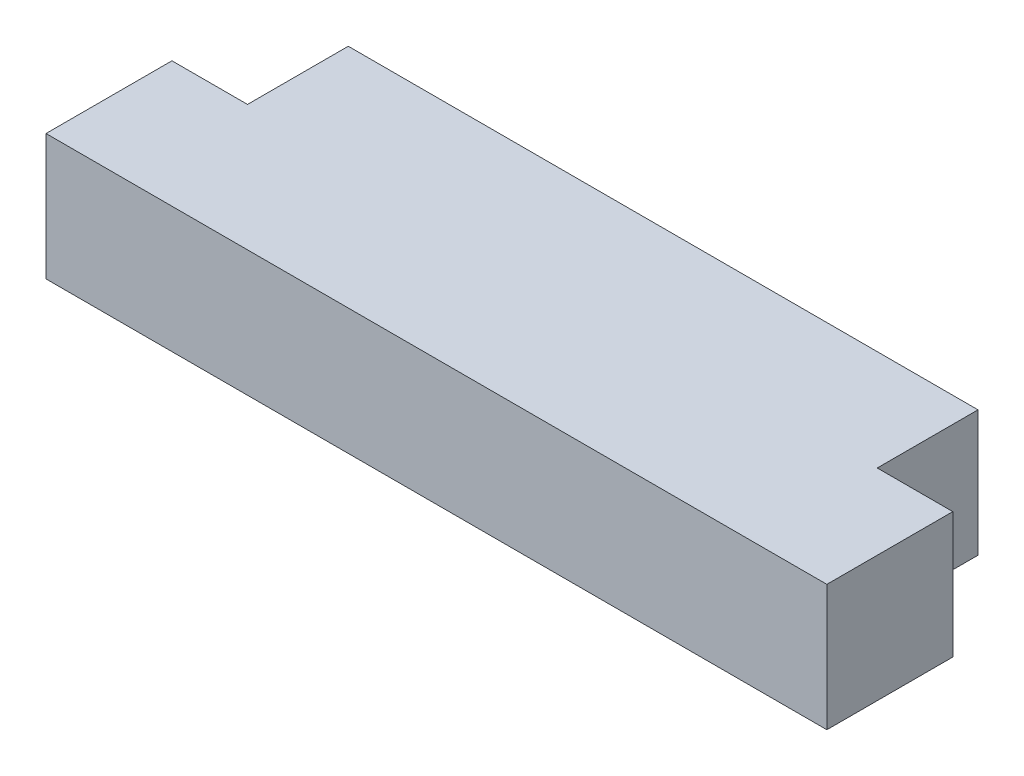
ISO-10303-21;
HEADER;
FILE_DESCRIPTION(('STEP AP214'),'2;1');
FILE_NAME('part.step','',(''),(''),'','','');
FILE_SCHEMA(('AUTOMOTIVE_DESIGN { 1 0 10303 214 1 1 1 1 }'));
ENDSEC;
DATA;
#1=APPLICATION_CONTEXT('core data for automotive mechanical design processes');
#2=APPLICATION_PROTOCOL_DEFINITION('international standard','automotive_design',2000,#1);
#3=PRODUCT_CONTEXT('',#1,'mechanical');
#4=PRODUCT('Part','Part','',(#3));
#5=PRODUCT_RELATED_PRODUCT_CATEGORY('part','',(#4));
#6=PRODUCT_DEFINITION_FORMATION('','',#4);
#7=PRODUCT_DEFINITION_CONTEXT('part definition',#1,'design');
#8=PRODUCT_DEFINITION('design','',#6,#7);
#9=PRODUCT_DEFINITION_SHAPE('','',#8);
#10=(LENGTH_UNIT() NAMED_UNIT(*) SI_UNIT(.MILLI.,.METRE.));
#11=(NAMED_UNIT(*) PLANE_ANGLE_UNIT() SI_UNIT($,.RADIAN.));
#12=(NAMED_UNIT(*) SI_UNIT($,.STERADIAN.) SOLID_ANGLE_UNIT());
#13=UNCERTAINTY_MEASURE_WITH_UNIT(LENGTH_MEASURE(1.E-05),#10,'distance_accuracy_value','');
#14=(GEOMETRIC_REPRESENTATION_CONTEXT(3) GLOBAL_UNCERTAINTY_ASSIGNED_CONTEXT((#13)) GLOBAL_UNIT_ASSIGNED_CONTEXT((#10,
#11,#12)) REPRESENTATION_CONTEXT('',''));
#15=CARTESIAN_POINT('',(0.,0.,0.));
#16=DIRECTION('',(0.,0.,1.));
#17=DIRECTION('',(1.,0.,0.));
#18=AXIS2_PLACEMENT_3D('',#15,#16,#17);
#19=CARTESIAN_POINT('',(31.,5.,0.));
#20=DIRECTION('',(0.,0.,-1.));
#21=DIRECTION('',(-1.,0.,0.));
#22=AXIS2_PLACEMENT_3D('',#19,#20,#21);
#23=PLANE('',#22);
#24=DIRECTION('',(1.,0.,0.));
#25=VECTOR('',#24,1.);
#26=CARTESIAN_POINT('',(31.,0.,0.));
#27=LINE('',#26,#25);
#28=CARTESIAN_POINT('',(0.,0.,0.));
#29=VERTEX_POINT('',#28);
#30=CARTESIAN_POINT('',(31.,0.,0.));
#31=VERTEX_POINT('',#30);
#32=EDGE_CURVE('E144',#29,#31,#27,.T.);
#33=ORIENTED_EDGE('',*,*,#32,.T.);
#34=DIRECTION('',(0.,-1.,0.));
#35=VECTOR('',#34,1.);
#36=CARTESIAN_POINT('',(31.,5.,0.));
#37=LINE('',#36,#35);
#38=CARTESIAN_POINT('',(31.,5.,0.));
#39=VERTEX_POINT('',#38);
#40=EDGE_CURVE('E11',#39,#31,#37,.T.);
#41=ORIENTED_EDGE('',*,*,#40,.F.);
#42=DIRECTION('',(1.,0.,0.));
#43=VECTOR('',#42,1.);
#44=CARTESIAN_POINT('',(31.,5.,0.));
#45=LINE('',#44,#43);
#46=CARTESIAN_POINT('',(0.,5.,0.));
#47=VERTEX_POINT('',#46);
#48=EDGE_CURVE('E166',#47,#39,#45,.T.);
#49=ORIENTED_EDGE('',*,*,#48,.F.);
#50=DIRECTION('',(0.,-1.,0.));
#51=VECTOR('',#50,1.);
#52=CARTESIAN_POINT('',(0.,5.,0.));
#53=LINE('',#52,#51);
#54=EDGE_CURVE('E140',#47,#29,#53,.T.);
#55=ORIENTED_EDGE('',*,*,#54,.T.);
#56=EDGE_LOOP('',(#33,#41,#49,#55));
#57=FACE_BOUND('',#56,.T.);
#58=ADVANCED_FACE('F43',(#57),#23,.F.);
#59=CARTESIAN_POINT('',(31.,5.,-5.));
#60=DIRECTION('',(-1.,0.,0.));
#61=DIRECTION('',(0.,0.,1.));
#62=AXIS2_PLACEMENT_3D('',#59,#60,#61);
#63=PLANE('',#62);
#64=DIRECTION('',(0.,0.,-1.));
#65=VECTOR('',#64,1.);
#66=CARTESIAN_POINT('',(31.,0.,-5.));
#67=LINE('',#66,#65);
#68=CARTESIAN_POINT('',(31.,0.,-5.));
#69=VERTEX_POINT('',#68);
#70=EDGE_CURVE('E148',#31,#69,#67,.T.);
#71=ORIENTED_EDGE('',*,*,#70,.T.);
#72=DIRECTION('',(0.,-1.,0.));
#73=VECTOR('',#72,1.);
#74=CARTESIAN_POINT('',(31.,5.,-5.));
#75=LINE('',#74,#73);
#76=CARTESIAN_POINT('',(31.,5.,-5.));
#77=VERTEX_POINT('',#76);
#78=EDGE_CURVE('E52',#77,#69,#75,.T.);
#79=ORIENTED_EDGE('',*,*,#78,.F.);
#80=DIRECTION('',(0.,0.,-1.));
#81=VECTOR('',#80,1.);
#82=CARTESIAN_POINT('',(31.,5.,-5.));
#83=LINE('',#82,#81);
#84=EDGE_CURVE('E103',#39,#77,#83,.T.);
#85=ORIENTED_EDGE('',*,*,#84,.F.);
#86=ORIENTED_EDGE('',*,*,#40,.T.);
#87=EDGE_LOOP('',(#71,#79,#85,#86));
#88=FACE_BOUND('',#87,.T.);
#89=ADVANCED_FACE('F212',(#88),#63,.F.);
#90=CARTESIAN_POINT('',(28.,5.,-5.));
#91=DIRECTION('',(0.,0.,1.));
#92=DIRECTION('',(1.,0.,0.));
#93=AXIS2_PLACEMENT_3D('',#90,#91,#92);
#94=PLANE('',#93);
#95=DIRECTION('',(-1.,0.,0.));
#96=VECTOR('',#95,1.);
#97=CARTESIAN_POINT('',(28.,0.,-5.));
#98=LINE('',#97,#96);
#99=CARTESIAN_POINT('',(28.,0.,-5.));
#100=VERTEX_POINT('',#99);
#101=EDGE_CURVE('E151',#69,#100,#98,.T.);
#102=ORIENTED_EDGE('',*,*,#101,.T.);
#103=DIRECTION('',(0.,-1.,0.));
#104=VECTOR('',#103,1.);
#105=CARTESIAN_POINT('',(28.,5.,-5.));
#106=LINE('',#105,#104);
#107=CARTESIAN_POINT('',(28.,5.,-5.));
#108=VERTEX_POINT('',#107);
#109=EDGE_CURVE('E177',#108,#100,#106,.T.);
#110=ORIENTED_EDGE('',*,*,#109,.F.);
#111=DIRECTION('',(-1.,0.,0.));
#112=VECTOR('',#111,1.);
#113=CARTESIAN_POINT('',(28.,5.,-5.));
#114=LINE('',#113,#112);
#115=EDGE_CURVE('E187',#77,#108,#114,.T.);
#116=ORIENTED_EDGE('',*,*,#115,.F.);
#117=ORIENTED_EDGE('',*,*,#78,.T.);
#118=EDGE_LOOP('',(#102,#110,#116,#117));
#119=FACE_BOUND('',#118,.T.);
#120=ADVANCED_FACE('F185',(#119),#94,.F.);
#121=CARTESIAN_POINT('',(28.,5.,-9.));
#122=DIRECTION('',(-1.,0.,0.));
#123=DIRECTION('',(0.,0.,1.));
#124=AXIS2_PLACEMENT_3D('',#121,#122,#123);
#125=PLANE('',#124);
#126=DIRECTION('',(0.,0.,-1.));
#127=VECTOR('',#126,1.);
#128=CARTESIAN_POINT('',(28.,0.,-9.));
#129=LINE('',#128,#127);
#130=CARTESIAN_POINT('',(28.,0.,-9.));
#131=VERTEX_POINT('',#130);
#132=EDGE_CURVE('E154',#100,#131,#129,.T.);
#133=ORIENTED_EDGE('',*,*,#132,.T.);
#134=DIRECTION('',(0.,-1.,0.));
#135=VECTOR('',#134,1.);
#136=CARTESIAN_POINT('',(28.,5.,-9.));
#137=LINE('',#136,#135);
#138=CARTESIAN_POINT('',(28.,5.,-9.));
#139=VERTEX_POINT('',#138);
#140=EDGE_CURVE('E173',#139,#131,#137,.T.);
#141=ORIENTED_EDGE('',*,*,#140,.F.);
#142=DIRECTION('',(0.,0.,-1.));
#143=VECTOR('',#142,1.);
#144=CARTESIAN_POINT('',(28.,5.,-9.));
#145=LINE('',#144,#143);
#146=EDGE_CURVE('E200',#108,#139,#145,.T.);
#147=ORIENTED_EDGE('',*,*,#146,.F.);
#148=ORIENTED_EDGE('',*,*,#109,.T.);
#149=EDGE_LOOP('',(#133,#141,#147,#148));
#150=FACE_BOUND('',#149,.T.);
#151=ADVANCED_FACE('F195',(#150),#125,.F.);
#152=CARTESIAN_POINT('',(3.,5.,-9.));
#153=DIRECTION('',(0.,0.,1.));
#154=DIRECTION('',(1.,0.,0.));
#155=AXIS2_PLACEMENT_3D('',#152,#153,#154);
#156=PLANE('',#155);
#157=DIRECTION('',(-1.,0.,0.));
#158=VECTOR('',#157,1.);
#159=CARTESIAN_POINT('',(3.,0.,-9.));
#160=LINE('',#159,#158);
#161=CARTESIAN_POINT('',(3.,0.,-9.));
#162=VERTEX_POINT('',#161);
#163=EDGE_CURVE('E157',#131,#162,#160,.T.);
#164=ORIENTED_EDGE('',*,*,#163,.T.);
#165=DIRECTION('',(0.,-1.,0.));
#166=VECTOR('',#165,1.);
#167=CARTESIAN_POINT('',(3.,5.,-9.));
#168=LINE('',#167,#166);
#169=CARTESIAN_POINT('',(3.,5.,-9.));
#170=VERTEX_POINT('',#169);
#171=EDGE_CURVE('E133',#170,#162,#168,.T.);
#172=ORIENTED_EDGE('',*,*,#171,.F.);
#173=DIRECTION('',(-1.,0.,0.));
#174=VECTOR('',#173,1.);
#175=CARTESIAN_POINT('',(3.,5.,-9.));
#176=LINE('',#175,#174);
#177=EDGE_CURVE('E122',#139,#170,#176,.T.);
#178=ORIENTED_EDGE('',*,*,#177,.F.);
#179=ORIENTED_EDGE('',*,*,#140,.T.);
#180=EDGE_LOOP('',(#164,#172,#178,#179));
#181=FACE_BOUND('',#180,.T.);
#182=ADVANCED_FACE('F198',(#181),#156,.F.);
#183=CARTESIAN_POINT('',(3.,5.,-5.));
#184=DIRECTION('',(1.,0.,0.));
#185=DIRECTION('',(0.,0.,-1.));
#186=AXIS2_PLACEMENT_3D('',#183,#184,#185);
#187=PLANE('',#186);
#188=DIRECTION('',(0.,0.,1.));
#189=VECTOR('',#188,1.);
#190=CARTESIAN_POINT('',(3.,0.,-5.));
#191=LINE('',#190,#189);
#192=CARTESIAN_POINT('',(3.,0.,-5.));
#193=VERTEX_POINT('',#192);
#194=EDGE_CURVE('E131',#162,#193,#191,.T.);
#195=ORIENTED_EDGE('',*,*,#194,.T.);
#196=DIRECTION('',(0.,-1.,0.));
#197=VECTOR('',#196,1.);
#198=CARTESIAN_POINT('',(3.,5.,-5.));
#199=LINE('',#198,#197);
#200=CARTESIAN_POINT('',(3.,5.,-5.));
#201=VERTEX_POINT('',#200);
#202=EDGE_CURVE('E128',#201,#193,#199,.T.);
#203=ORIENTED_EDGE('',*,*,#202,.F.);
#204=DIRECTION('',(0.,0.,1.));
#205=VECTOR('',#204,1.);
#206=CARTESIAN_POINT('',(3.,5.,-5.));
#207=LINE('',#206,#205);
#208=EDGE_CURVE('E116',#170,#201,#207,.T.);
#209=ORIENTED_EDGE('',*,*,#208,.F.);
#210=ORIENTED_EDGE('',*,*,#171,.T.);
#211=EDGE_LOOP('',(#195,#203,#209,#210));
#212=FACE_BOUND('',#211,.T.);
#213=ADVANCED_FACE('F129',(#212),#187,.F.);
#214=CARTESIAN_POINT('',(0.,5.,-5.));
#215=DIRECTION('',(0.,0.,1.));
#216=DIRECTION('',(1.,0.,0.));
#217=AXIS2_PLACEMENT_3D('',#214,#215,#216);
#218=PLANE('',#217);
#219=DIRECTION('',(-1.,0.,0.));
#220=VECTOR('',#219,1.);
#221=CARTESIAN_POINT('',(0.,0.,-5.));
#222=LINE('',#221,#220);
#223=CARTESIAN_POINT('',(0.,0.,-5.));
#224=VERTEX_POINT('',#223);
#225=EDGE_CURVE('E89',#193,#224,#222,.T.);
#226=ORIENTED_EDGE('',*,*,#225,.T.);
#227=DIRECTION('',(0.,-1.,0.));
#228=VECTOR('',#227,1.);
#229=CARTESIAN_POINT('',(0.,5.,-5.));
#230=LINE('',#229,#228);
#231=CARTESIAN_POINT('',(0.,5.,-5.));
#232=VERTEX_POINT('',#231);
#233=EDGE_CURVE('E134',#232,#224,#230,.T.);
#234=ORIENTED_EDGE('',*,*,#233,.F.);
#235=DIRECTION('',(-1.,0.,0.));
#236=VECTOR('',#235,1.);
#237=CARTESIAN_POINT('',(0.,5.,-5.));
#238=LINE('',#237,#236);
#239=EDGE_CURVE('E120',#201,#232,#238,.T.);
#240=ORIENTED_EDGE('',*,*,#239,.F.);
#241=ORIENTED_EDGE('',*,*,#202,.T.);
#242=EDGE_LOOP('',(#226,#234,#240,#241));
#243=FACE_BOUND('',#242,.T.);
#244=ADVANCED_FACE('F136',(#243),#218,.F.);
#245=CARTESIAN_POINT('',(0.,5.,0.));
#246=DIRECTION('',(1.,0.,0.));
#247=DIRECTION('',(0.,0.,-1.));
#248=AXIS2_PLACEMENT_3D('',#245,#246,#247);
#249=PLANE('',#248);
#250=DIRECTION('',(0.,0.,1.));
#251=VECTOR('',#250,1.);
#252=CARTESIAN_POINT('',(0.,0.,0.));
#253=LINE('',#252,#251);
#254=EDGE_CURVE('E95',#224,#29,#253,.T.);
#255=ORIENTED_EDGE('',*,*,#254,.T.);
#256=ORIENTED_EDGE('',*,*,#54,.F.);
#257=DIRECTION('',(0.,0.,1.));
#258=VECTOR('',#257,1.);
#259=CARTESIAN_POINT('',(0.,5.,0.));
#260=LINE('',#259,#258);
#261=EDGE_CURVE('E60',#232,#47,#260,.T.);
#262=ORIENTED_EDGE('',*,*,#261,.F.);
#263=ORIENTED_EDGE('',*,*,#233,.T.);
#264=EDGE_LOOP('',(#255,#256,#262,#263));
#265=FACE_BOUND('',#264,.T.);
#266=ADVANCED_FACE('F228',(#265),#249,.F.);
#267=CARTESIAN_POINT('',(0.,5.,0.));
#268=DIRECTION('',(0.,-1.,0.));
#269=DIRECTION('',(0.,0.,-1.));
#270=AXIS2_PLACEMENT_3D('',#267,#268,#269);
#271=PLANE('',#270);
#272=ORIENTED_EDGE('',*,*,#48,.T.);
#273=ORIENTED_EDGE('',*,*,#84,.T.);
#274=ORIENTED_EDGE('',*,*,#115,.T.);
#275=ORIENTED_EDGE('',*,*,#146,.T.);
#276=ORIENTED_EDGE('',*,*,#177,.T.);
#277=ORIENTED_EDGE('',*,*,#208,.T.);
#278=ORIENTED_EDGE('',*,*,#239,.T.);
#279=ORIENTED_EDGE('',*,*,#261,.T.);
#280=EDGE_LOOP('',(#272,#273,#274,#275,#276,#277,#278,#279));
#281=FACE_BOUND('',#280,.T.);
#282=ADVANCED_FACE('F118',(#281),#271,.F.);
#283=CARTESIAN_POINT('',(0.,0.,0.));
#284=DIRECTION('',(0.,-1.,0.));
#285=DIRECTION('',(0.,0.,-1.));
#286=AXIS2_PLACEMENT_3D('',#283,#284,#285);
#287=PLANE('',#286);
#288=ORIENTED_EDGE('',*,*,#32,.F.);
#289=ORIENTED_EDGE('',*,*,#254,.F.);
#290=ORIENTED_EDGE('',*,*,#225,.F.);
#291=ORIENTED_EDGE('',*,*,#194,.F.);
#292=ORIENTED_EDGE('',*,*,#163,.F.);
#293=ORIENTED_EDGE('',*,*,#132,.F.);
#294=ORIENTED_EDGE('',*,*,#101,.F.);
#295=ORIENTED_EDGE('',*,*,#70,.F.);
#296=EDGE_LOOP('',(#288,#289,#290,#291,#292,#293,#294,#295));
#297=FACE_BOUND('',#296,.T.);
#298=ADVANCED_FACE('F191',(#297),#287,.T.);
#299=CLOSED_SHELL('',(#58,#89,#120,#151,#182,#213,#244,#266,#282,#298));
#300=MANIFOLD_SOLID_BREP('B2',#299);
#301=ADVANCED_BREP_SHAPE_REPRESENTATION('',(#18,#300),#14);
#302=SHAPE_DEFINITION_REPRESENTATION(#9,#301);
ENDSEC;
END-ISO-10303-21;
